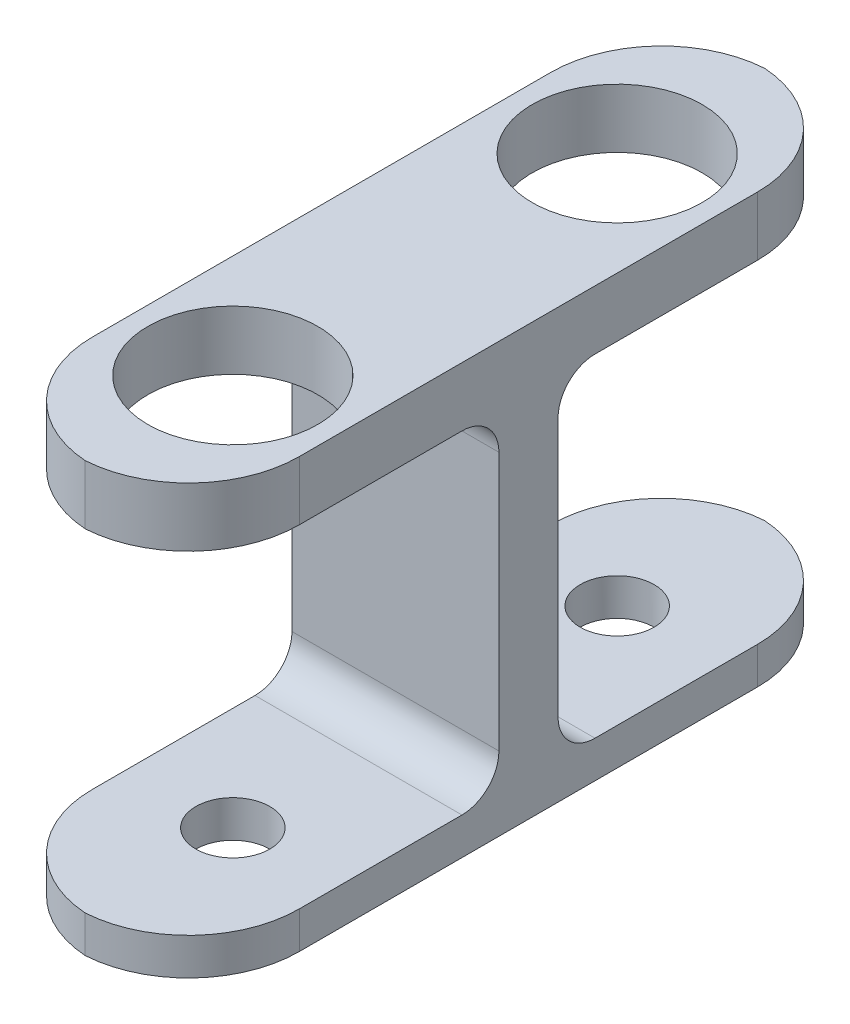
ISO-10303-21;
HEADER;
FILE_DESCRIPTION(('STEP AP214'),'2;1');
FILE_NAME('part.step','',(''),(''),'','','');
FILE_SCHEMA(('AUTOMOTIVE_DESIGN { 1 0 10303 214 1 1 1 1 }'));
ENDSEC;
DATA;
#1=APPLICATION_CONTEXT('core data for automotive mechanical design processes');
#2=APPLICATION_PROTOCOL_DEFINITION('international standard','automotive_design',2000,#1);
#3=PRODUCT_CONTEXT('',#1,'mechanical');
#4=PRODUCT('Part','Part','',(#3));
#5=PRODUCT_RELATED_PRODUCT_CATEGORY('part','',(#4));
#6=PRODUCT_DEFINITION_FORMATION('','',#4);
#7=PRODUCT_DEFINITION_CONTEXT('part definition',#1,'design');
#8=PRODUCT_DEFINITION('design','',#6,#7);
#9=PRODUCT_DEFINITION_SHAPE('','',#8);
#10=(LENGTH_UNIT() NAMED_UNIT(*) SI_UNIT(.MILLI.,.METRE.));
#11=(NAMED_UNIT(*) PLANE_ANGLE_UNIT() SI_UNIT($,.RADIAN.));
#12=(NAMED_UNIT(*) SI_UNIT($,.STERADIAN.) SOLID_ANGLE_UNIT());
#13=UNCERTAINTY_MEASURE_WITH_UNIT(LENGTH_MEASURE(1.E-05),#10,'distance_accuracy_value','');
#14=(GEOMETRIC_REPRESENTATION_CONTEXT(3) GLOBAL_UNCERTAINTY_ASSIGNED_CONTEXT((#13)) GLOBAL_UNIT_ASSIGNED_CONTEXT((#10,
#11,#12)) REPRESENTATION_CONTEXT('',''));
#15=CARTESIAN_POINT('',(0.,0.,0.));
#16=DIRECTION('',(0.,0.,1.));
#17=DIRECTION('',(1.,0.,0.));
#18=AXIS2_PLACEMENT_3D('',#15,#16,#17);
#19=CARTESIAN_POINT('',(28.,0.,0.));
#20=DIRECTION('',(0.,1.,0.));
#21=DIRECTION('',(0.,0.,1.));
#22=AXIS2_PLACEMENT_3D('',#19,#20,#21);
#23=PLANE('',#22);
#24=CARTESIAN_POINT('',(14.,0.,-20.));
#25=DIRECTION('',(0.,1.,0.));
#26=DIRECTION('',(0.,0.,1.));
#27=AXIS2_PLACEMENT_3D('',#24,#25,#26);
#28=CIRCLE('',#27,11.5);
#29=CARTESIAN_POINT('',(14.,0.,-8.5));
#30=VERTEX_POINT('',#29);
#31=EDGE_CURVE('E205',#30,#30,#28,.F.);
#32=ORIENTED_EDGE('',*,*,#31,.F.);
#33=EDGE_LOOP('',(#32));
#34=FACE_BOUND('',#33,.T.);
#35=DIRECTION('',(0.,0.,-1.));
#36=VECTOR('',#35,1.);
#37=CARTESIAN_POINT('',(28.,0.,0.));
#38=LINE('',#37,#36);
#39=CARTESIAN_POINT('',(28.,0.,-15.));
#40=VERTEX_POINT('',#39);
#41=CARTESIAN_POINT('',(28.,0.,-37.));
#42=VERTEX_POINT('',#41);
#43=EDGE_CURVE('E214',#40,#42,#38,.T.);
#44=ORIENTED_EDGE('',*,*,#43,.F.);
#45=CARTESIAN_POINT('',(13.,0.,-15.));
#46=DIRECTION('',(0.,1.,0.));
#47=DIRECTION('',(0.,0.,1.));
#48=AXIS2_PLACEMENT_3D('',#45,#46,#47);
#49=CIRCLE('',#48,15.);
#50=CARTESIAN_POINT('',(14.,0.,-0.0333704529042328));
#51=VERTEX_POINT('',#50);
#52=EDGE_CURVE('E277',#40,#51,#49,.F.);
#53=ORIENTED_EDGE('',*,*,#52,.T.);
#54=CARTESIAN_POINT('',(15.,0.,-15.));
#55=DIRECTION('',(0.,1.,0.));
#56=DIRECTION('',(0.,0.,1.));
#57=AXIS2_PLACEMENT_3D('',#54,#55,#56);
#58=CIRCLE('',#57,15.);
#59=CARTESIAN_POINT('',(0.,0.,-15.));
#60=VERTEX_POINT('',#59);
#61=EDGE_CURVE('E275',#51,#60,#58,.F.);
#62=ORIENTED_EDGE('',*,*,#61,.T.);
#63=DIRECTION('',(0.,0.,-1.));
#64=VECTOR('',#63,1.);
#65=CARTESIAN_POINT('',(0.,0.,0.));
#66=LINE('',#65,#64);
#67=CARTESIAN_POINT('',(0.,0.,-37.));
#68=VERTEX_POINT('',#67);
#69=EDGE_CURVE('E200',#60,#68,#66,.T.);
#70=ORIENTED_EDGE('',*,*,#69,.T.);
#71=DIRECTION('',(-1.,0.,0.));
#72=VECTOR('',#71,1.);
#73=CARTESIAN_POINT('',(28.,0.,-37.));
#74=LINE('',#73,#72);
#75=EDGE_CURVE('E178',#68,#42,#74,.F.);
#76=ORIENTED_EDGE('',*,*,#75,.T.);
#77=EDGE_LOOP('',(#44,#53,#62,#70,#76));
#78=FACE_BOUND('',#77,.T.);
#79=ADVANCED_FACE('F33',(#34,#78),#23,.F.);
#80=CARTESIAN_POINT('',(28.,0.,-42.));
#81=DIRECTION('',(0.,0.,-1.));
#82=DIRECTION('',(0.,1.,0.));
#83=AXIS2_PLACEMENT_3D('',#80,#81,#82);
#84=PLANE('',#83);
#85=DIRECTION('',(0.,-1.,0.));
#86=VECTOR('',#85,1.);
#87=CARTESIAN_POINT('',(28.,0.,-42.));
#88=LINE('',#87,#86);
#89=CARTESIAN_POINT('',(28.,-5.,-42.));
#90=VERTEX_POINT('',#89);
#91=CARTESIAN_POINT('',(28.,-40.,-42.));
#92=VERTEX_POINT('',#91);
#93=EDGE_CURVE('E192',#90,#92,#88,.T.);
#94=ORIENTED_EDGE('',*,*,#93,.F.);
#95=DIRECTION('',(-1.,0.,0.));
#96=VECTOR('',#95,1.);
#97=CARTESIAN_POINT('',(0.,-5.,-42.));
#98=LINE('',#97,#96);
#99=CARTESIAN_POINT('',(0.,-5.,-42.));
#100=VERTEX_POINT('',#99);
#101=EDGE_CURVE('E176',#90,#100,#98,.T.);
#102=ORIENTED_EDGE('',*,*,#101,.T.);
#103=DIRECTION('',(0.,-1.,0.));
#104=VECTOR('',#103,1.);
#105=CARTESIAN_POINT('',(0.,0.,-42.));
#106=LINE('',#105,#104);
#107=CARTESIAN_POINT('',(0.,-40.,-42.));
#108=VERTEX_POINT('',#107);
#109=EDGE_CURVE('E189',#100,#108,#106,.T.);
#110=ORIENTED_EDGE('',*,*,#109,.T.);
#111=DIRECTION('',(-1.,0.,0.));
#112=VECTOR('',#111,1.);
#113=CARTESIAN_POINT('',(28.,-40.,-42.));
#114=LINE('',#113,#112);
#115=EDGE_CURVE('E193',#108,#92,#114,.F.);
#116=ORIENTED_EDGE('',*,*,#115,.T.);
#117=EDGE_LOOP('',(#94,#102,#110,#116));
#118=FACE_BOUND('',#117,.T.);
#119=ADVANCED_FACE('F188',(#118),#84,.F.);
#120=CARTESIAN_POINT('',(28.,-45.,-42.));
#121=DIRECTION('',(0.,-1.,0.));
#122=DIRECTION('',(0.,0.,-1.));
#123=AXIS2_PLACEMENT_3D('',#120,#121,#122);
#124=PLANE('',#123);
#125=CARTESIAN_POINT('',(14.,-45.,-20.));
#126=DIRECTION('',(0.,1.,0.));
#127=DIRECTION('',(0.,0.,1.));
#128=AXIS2_PLACEMENT_3D('',#125,#126,#127);
#129=CIRCLE('',#128,5.);
#130=CARTESIAN_POINT('',(14.,-45.,-15.));
#131=VERTEX_POINT('',#130);
#132=EDGE_CURVE('E335',#131,#131,#129,.T.);
#133=ORIENTED_EDGE('',*,*,#132,.F.);
#134=EDGE_LOOP('',(#133));
#135=FACE_BOUND('',#134,.T.);
#136=CARTESIAN_POINT('',(15.,-45.,-15.));
#137=DIRECTION('',(0.,-1.,0.));
#138=DIRECTION('',(0.,0.,-1.));
#139=AXIS2_PLACEMENT_3D('',#136,#137,#138);
#140=CIRCLE('',#139,15.);
#141=CARTESIAN_POINT('',(0.,-45.,-15.));
#142=VERTEX_POINT('',#141);
#143=CARTESIAN_POINT('',(14.,-45.,-0.0333704529042484));
#144=VERTEX_POINT('',#143);
#145=EDGE_CURVE('E261',#142,#144,#140,.F.);
#146=ORIENTED_EDGE('',*,*,#145,.T.);
#147=CARTESIAN_POINT('',(13.,-45.,-15.));
#148=DIRECTION('',(0.,-1.,0.));
#149=DIRECTION('',(0.,0.,-1.));
#150=AXIS2_PLACEMENT_3D('',#147,#148,#149);
#151=CIRCLE('',#150,15.);
#152=CARTESIAN_POINT('',(28.,-45.,-15.));
#153=VERTEX_POINT('',#152);
#154=EDGE_CURVE('E263',#144,#153,#151,.F.);
#155=ORIENTED_EDGE('',*,*,#154,.T.);
#156=DIRECTION('',(0.,0.,1.));
#157=VECTOR('',#156,1.);
#158=CARTESIAN_POINT('',(28.,-45.,-42.));
#159=LINE('',#158,#157);
#160=CARTESIAN_POINT('',(28.,-45.,-37.));
#161=VERTEX_POINT('',#160);
#162=EDGE_CURVE('E320',#161,#153,#159,.T.);
#163=ORIENTED_EDGE('',*,*,#162,.F.);
#164=DIRECTION('',(-1.,0.,0.));
#165=VECTOR('',#164,1.);
#166=CARTESIAN_POINT('',(0.,-45.,-37.));
#167=LINE('',#166,#165);
#168=CARTESIAN_POINT('',(0.,-45.,-37.));
#169=VERTEX_POINT('',#168);
#170=EDGE_CURVE('E183',#161,#169,#167,.T.);
#171=ORIENTED_EDGE('',*,*,#170,.T.);
#172=DIRECTION('',(0.,0.,1.));
#173=VECTOR('',#172,1.);
#174=CARTESIAN_POINT('',(0.,-45.,-42.));
#175=LINE('',#174,#173);
#176=EDGE_CURVE('E199',#169,#142,#175,.T.);
#177=ORIENTED_EDGE('',*,*,#176,.T.);
#178=EDGE_LOOP('',(#146,#155,#163,#171,#177));
#179=FACE_BOUND('',#178,.T.);
#180=ADVANCED_FACE('F378',(#135,#179),#124,.F.);
#181=CARTESIAN_POINT('',(28.,-50.,0.));
#182=DIRECTION('',(0.,1.,0.));
#183=DIRECTION('',(0.,0.,1.));
#184=AXIS2_PLACEMENT_3D('',#181,#182,#183);
#185=PLANE('',#184);
#186=CARTESIAN_POINT('',(14.,-50.,-72.));
#187=DIRECTION('',(0.,1.,0.));
#188=DIRECTION('',(0.,0.,1.));
#189=AXIS2_PLACEMENT_3D('',#186,#187,#188);
#190=CIRCLE('',#189,5.);
#191=CARTESIAN_POINT('',(14.,-50.,-67.));
#192=VERTEX_POINT('',#191);
#193=EDGE_CURVE('E294',#192,#192,#190,.T.);
#194=ORIENTED_EDGE('',*,*,#193,.T.);
#195=EDGE_LOOP('',(#194));
#196=FACE_BOUND('',#195,.T.);
#197=CARTESIAN_POINT('',(14.,-50.,-20.));
#198=DIRECTION('',(0.,1.,0.));
#199=DIRECTION('',(0.,0.,1.));
#200=AXIS2_PLACEMENT_3D('',#197,#198,#199);
#201=CIRCLE('',#200,5.);
#202=CARTESIAN_POINT('',(14.,-50.,-15.));
#203=VERTEX_POINT('',#202);
#204=EDGE_CURVE('E330',#203,#203,#201,.F.);
#205=ORIENTED_EDGE('',*,*,#204,.F.);
#206=EDGE_LOOP('',(#205));
#207=FACE_BOUND('',#206,.T.);
#208=DIRECTION('',(0.,0.,-1.));
#209=VECTOR('',#208,1.);
#210=CARTESIAN_POINT('',(28.,-50.,0.));
#211=LINE('',#210,#209);
#212=CARTESIAN_POINT('',(28.,-50.,-15.));
#213=VERTEX_POINT('',#212);
#214=CARTESIAN_POINT('',(28.,-50.,-77.));
#215=VERTEX_POINT('',#214);
#216=EDGE_CURVE('E314',#213,#215,#211,.T.);
#217=ORIENTED_EDGE('',*,*,#216,.F.);
#218=CARTESIAN_POINT('',(13.,-50.,-15.));
#219=DIRECTION('',(0.,1.,0.));
#220=DIRECTION('',(0.,0.,1.));
#221=AXIS2_PLACEMENT_3D('',#218,#219,#220);
#222=CIRCLE('',#221,15.);
#223=CARTESIAN_POINT('',(14.,-50.,-0.0333704529042415));
#224=VERTEX_POINT('',#223);
#225=EDGE_CURVE('E259',#213,#224,#222,.F.);
#226=ORIENTED_EDGE('',*,*,#225,.T.);
#227=CARTESIAN_POINT('',(15.,-50.,-15.));
#228=DIRECTION('',(0.,1.,0.));
#229=DIRECTION('',(0.,0.,1.));
#230=AXIS2_PLACEMENT_3D('',#227,#228,#229);
#231=CIRCLE('',#230,15.);
#232=CARTESIAN_POINT('',(0.,-50.,-15.));
#233=VERTEX_POINT('',#232);
#234=EDGE_CURVE('E257',#224,#233,#231,.F.);
#235=ORIENTED_EDGE('',*,*,#234,.T.);
#236=DIRECTION('',(0.,0.,-1.));
#237=VECTOR('',#236,1.);
#238=CARTESIAN_POINT('',(0.,-50.,0.));
#239=LINE('',#238,#237);
#240=CARTESIAN_POINT('',(0.,-50.,-77.));
#241=VERTEX_POINT('',#240);
#242=EDGE_CURVE('E203',#233,#241,#239,.T.);
#243=ORIENTED_EDGE('',*,*,#242,.T.);
#244=CARTESIAN_POINT('',(15.,-50.,-77.));
#245=DIRECTION('',(0.,1.,0.));
#246=DIRECTION('',(0.,0.,1.));
#247=AXIS2_PLACEMENT_3D('',#244,#245,#246);
#248=CIRCLE('',#247,15.);
#249=CARTESIAN_POINT('',(13.9999999999999,-50.,-91.9666295470958));
#250=VERTEX_POINT('',#249);
#251=EDGE_CURVE('E255',#241,#250,#248,.F.);
#252=ORIENTED_EDGE('',*,*,#251,.T.);
#253=CARTESIAN_POINT('',(13.,-50.,-77.));
#254=DIRECTION('',(0.,1.,0.));
#255=DIRECTION('',(0.,0.,1.));
#256=AXIS2_PLACEMENT_3D('',#253,#254,#255);
#257=CIRCLE('',#256,15.);
#258=EDGE_CURVE('E253',#250,#215,#257,.F.);
#259=ORIENTED_EDGE('',*,*,#258,.T.);
#260=EDGE_LOOP('',(#217,#226,#235,#243,#252,#259));
#261=FACE_BOUND('',#260,.T.);
#262=ADVANCED_FACE('F313',(#196,#207,#261),#185,.F.);
#263=CARTESIAN_POINT('',(28.,8.00000000000001,-46.));
#264=DIRECTION('',(0.,-1.,0.));
#265=DIRECTION('',(0.,0.,-1.));
#266=AXIS2_PLACEMENT_3D('',#263,#264,#265);
#267=PLANE('',#266);
#268=CARTESIAN_POINT('',(14.,8.,-72.));
#269=DIRECTION('',(0.,-1.,0.));
#270=DIRECTION('',(0.,0.,-1.));
#271=AXIS2_PLACEMENT_3D('',#268,#269,#270);
#272=CIRCLE('',#271,11.5);
#273=CARTESIAN_POINT('',(14.,8.,-83.5));
#274=VERTEX_POINT('',#273);
#275=EDGE_CURVE('E348',#274,#274,#272,.T.);
#276=ORIENTED_EDGE('',*,*,#275,.T.);
#277=EDGE_LOOP('',(#276));
#278=FACE_BOUND('',#277,.T.);
#279=CARTESIAN_POINT('',(14.,8.,-20.));
#280=DIRECTION('',(0.,1.,0.));
#281=DIRECTION('',(0.,0.,1.));
#282=AXIS2_PLACEMENT_3D('',#279,#280,#281);
#283=CIRCLE('',#282,11.5);
#284=CARTESIAN_POINT('',(14.,8.,-8.5));
#285=VERTEX_POINT('',#284);
#286=EDGE_CURVE('E327',#285,#285,#283,.T.);
#287=ORIENTED_EDGE('',*,*,#286,.F.);
#288=EDGE_LOOP('',(#287));
#289=FACE_BOUND('',#288,.T.);
#290=CARTESIAN_POINT('',(15.,8.,-15.));
#291=DIRECTION('',(0.,-1.,0.));
#292=DIRECTION('',(0.,0.,-1.));
#293=AXIS2_PLACEMENT_3D('',#290,#291,#292);
#294=CIRCLE('',#293,15.);
#295=CARTESIAN_POINT('',(0.,8.,-15.));
#296=VERTEX_POINT('',#295);
#297=CARTESIAN_POINT('',(14.,8.,-0.0333704529042345));
#298=VERTEX_POINT('',#297);
#299=EDGE_CURVE('E283',#296,#298,#294,.F.);
#300=ORIENTED_EDGE('',*,*,#299,.T.);
#301=CARTESIAN_POINT('',(13.,8.,-15.));
#302=DIRECTION('',(0.,-1.,0.));
#303=DIRECTION('',(0.,0.,-1.));
#304=AXIS2_PLACEMENT_3D('',#301,#302,#303);
#305=CIRCLE('',#304,15.);
#306=CARTESIAN_POINT('',(28.,8.,-15.));
#307=VERTEX_POINT('',#306);
#308=EDGE_CURVE('E285',#298,#307,#305,.F.);
#309=ORIENTED_EDGE('',*,*,#308,.T.);
#310=DIRECTION('',(0.,0.,1.));
#311=VECTOR('',#310,1.);
#312=CARTESIAN_POINT('',(28.,8.00000000000001,-46.));
#313=LINE('',#312,#311);
#314=CARTESIAN_POINT('',(28.,8.00000000000001,-77.));
#315=VERTEX_POINT('',#314);
#316=EDGE_CURVE('E215',#315,#307,#313,.T.);
#317=ORIENTED_EDGE('',*,*,#316,.F.);
#318=CARTESIAN_POINT('',(13.,8.00000000000001,-77.));
#319=DIRECTION('',(0.,-1.,0.));
#320=DIRECTION('',(0.,0.,-1.));
#321=AXIS2_PLACEMENT_3D('',#318,#319,#320);
#322=CIRCLE('',#321,15.);
#323=CARTESIAN_POINT('',(14.,8.00000000000001,-91.9666295470958));
#324=VERTEX_POINT('',#323);
#325=EDGE_CURVE('E279',#315,#324,#322,.F.);
#326=ORIENTED_EDGE('',*,*,#325,.T.);
#327=CARTESIAN_POINT('',(15.,8.00000000000001,-77.));
#328=DIRECTION('',(0.,-1.,0.));
#329=DIRECTION('',(0.,0.,-1.));
#330=AXIS2_PLACEMENT_3D('',#327,#328,#329);
#331=CIRCLE('',#330,15.);
#332=CARTESIAN_POINT('',(0.,8.00000000000001,-77.));
#333=VERTEX_POINT('',#332);
#334=EDGE_CURVE('E281',#324,#333,#331,.F.);
#335=ORIENTED_EDGE('',*,*,#334,.T.);
#336=DIRECTION('',(0.,0.,1.));
#337=VECTOR('',#336,1.);
#338=CARTESIAN_POINT('',(0.,8.00000000000001,-46.));
#339=LINE('',#338,#337);
#340=EDGE_CURVE('E211',#333,#296,#339,.T.);
#341=ORIENTED_EDGE('',*,*,#340,.T.);
#342=EDGE_LOOP('',(#300,#309,#317,#326,#335,#341));
#343=FACE_BOUND('',#342,.T.);
#344=ADVANCED_FACE('F377',(#278,#289,#343),#267,.F.);
#345=CARTESIAN_POINT('',(28.,0.,0.));
#346=DIRECTION('',(1.,0.,0.));
#347=DIRECTION('',(0.,0.,-1.));
#348=AXIS2_PLACEMENT_3D('',#345,#346,#347);
#349=PLANE('',#348);
#350=ORIENTED_EDGE('',*,*,#162,.T.);
#351=DIRECTION('',(0.,-1.,0.));
#352=VECTOR('',#351,1.);
#353=CARTESIAN_POINT('',(28.,-50.,-15.));
#354=LINE('',#353,#352);
#355=EDGE_CURVE('E250',#153,#213,#354,.T.);
#356=ORIENTED_EDGE('',*,*,#355,.T.);
#357=ORIENTED_EDGE('',*,*,#216,.T.);
#358=DIRECTION('',(0.,-1.,0.));
#359=VECTOR('',#358,1.);
#360=CARTESIAN_POINT('',(28.,1.04332480140501E-13,-76.9999999999999));
#361=LINE('',#360,#359);
#362=CARTESIAN_POINT('',(28.,-45.,-77.));
#363=VERTEX_POINT('',#362);
#364=EDGE_CURVE('E245',#215,#363,#361,.F.);
#365=ORIENTED_EDGE('',*,*,#364,.T.);
#366=DIRECTION('',(0.,0.,-1.));
#367=VECTOR('',#366,1.);
#368=CARTESIAN_POINT('',(28.,-45.,-50.));
#369=LINE('',#368,#367);
#370=CARTESIAN_POINT('',(28.,-45.,-55.));
#371=VERTEX_POINT('',#370);
#372=EDGE_CURVE('E341',#371,#363,#369,.T.);
#373=ORIENTED_EDGE('',*,*,#372,.F.);
#374=CARTESIAN_POINT('',(28.,-40.,-55.));
#375=DIRECTION('',(1.,0.,0.));
#376=DIRECTION('',(0.,0.,-1.));
#377=AXIS2_PLACEMENT_3D('',#374,#375,#376);
#378=CIRCLE('',#377,5.);
#379=CARTESIAN_POINT('',(28.,-40.,-50.));
#380=VERTEX_POINT('',#379);
#381=EDGE_CURVE('E241',#371,#380,#378,.F.);
#382=ORIENTED_EDGE('',*,*,#381,.T.);
#383=DIRECTION('',(0.,-1.,0.));
#384=VECTOR('',#383,1.);
#385=CARTESIAN_POINT('',(28.,0.,-50.));
#386=LINE('',#385,#384);
#387=CARTESIAN_POINT('',(28.,-5.,-50.));
#388=VERTEX_POINT('',#387);
#389=EDGE_CURVE('E350',#388,#380,#386,.T.);
#390=ORIENTED_EDGE('',*,*,#389,.F.);
#391=CARTESIAN_POINT('',(28.,-5.,-55.));
#392=DIRECTION('',(1.,0.,0.));
#393=DIRECTION('',(0.,0.,-1.));
#394=AXIS2_PLACEMENT_3D('',#391,#392,#393);
#395=CIRCLE('',#394,5.);
#396=CARTESIAN_POINT('',(28.,0.,-55.));
#397=VERTEX_POINT('',#396);
#398=EDGE_CURVE('E236',#388,#397,#395,.F.);
#399=ORIENTED_EDGE('',*,*,#398,.T.);
#400=DIRECTION('',(0.,0.,1.));
#401=VECTOR('',#400,1.);
#402=CARTESIAN_POINT('',(28.,0.,-92.));
#403=LINE('',#402,#401);
#404=CARTESIAN_POINT('',(28.,0.,-77.));
#405=VERTEX_POINT('',#404);
#406=EDGE_CURVE('E338',#405,#397,#403,.T.);
#407=ORIENTED_EDGE('',*,*,#406,.F.);
#408=DIRECTION('',(0.,-1.,0.));
#409=VECTOR('',#408,1.);
#410=CARTESIAN_POINT('',(28.,0.,-77.));
#411=LINE('',#410,#409);
#412=EDGE_CURVE('E243',#405,#315,#411,.F.);
#413=ORIENTED_EDGE('',*,*,#412,.T.);
#414=ORIENTED_EDGE('',*,*,#316,.T.);
#415=DIRECTION('',(0.,-1.,0.));
#416=VECTOR('',#415,1.);
#417=CARTESIAN_POINT('',(28.,0.,-15.));
#418=LINE('',#417,#416);
#419=EDGE_CURVE('E247',#307,#40,#418,.T.);
#420=ORIENTED_EDGE('',*,*,#419,.T.);
#421=ORIENTED_EDGE('',*,*,#43,.T.);
#422=CARTESIAN_POINT('',(28.,-5.,-37.));
#423=DIRECTION('',(1.,0.,0.));
#424=DIRECTION('',(0.,0.,-1.));
#425=AXIS2_PLACEMENT_3D('',#422,#423,#424);
#426=CIRCLE('',#425,5.);
#427=EDGE_CURVE('E182',#42,#90,#426,.F.);
#428=ORIENTED_EDGE('',*,*,#427,.T.);
#429=ORIENTED_EDGE('',*,*,#93,.T.);
#430=CARTESIAN_POINT('',(28.,-40.,-37.));
#431=DIRECTION('',(1.,0.,0.));
#432=DIRECTION('',(0.,0.,-1.));
#433=AXIS2_PLACEMENT_3D('',#430,#431,#432);
#434=CIRCLE('',#433,5.);
#435=EDGE_CURVE('E222',#92,#161,#434,.F.);
#436=ORIENTED_EDGE('',*,*,#435,.T.);
#437=EDGE_LOOP('',(#350,#356,#357,#365,#373,#382,#390,#399,#407,#413,#414,#420,#421,#428,#429,#436));
#438=FACE_BOUND('',#437,.T.);
#439=ADVANCED_FACE('F317',(#438),#349,.T.);
#440=CARTESIAN_POINT('',(0.,0.,0.));
#441=DIRECTION('',(1.,0.,0.));
#442=DIRECTION('',(0.,0.,-1.));
#443=AXIS2_PLACEMENT_3D('',#440,#441,#442);
#444=PLANE('',#443);
#445=ORIENTED_EDGE('',*,*,#242,.F.);
#446=DIRECTION('',(0.,-1.,0.));
#447=VECTOR('',#446,1.);
#448=CARTESIAN_POINT('',(0.,0.,-15.0000000000001));
#449=LINE('',#448,#447);
#450=EDGE_CURVE('E273',#233,#142,#449,.F.);
#451=ORIENTED_EDGE('',*,*,#450,.T.);
#452=ORIENTED_EDGE('',*,*,#176,.F.);
#453=CARTESIAN_POINT('',(0.,-40.,-37.));
#454=DIRECTION('',(1.,0.,0.));
#455=DIRECTION('',(0.,0.,-1.));
#456=AXIS2_PLACEMENT_3D('',#453,#454,#455);
#457=CIRCLE('',#456,5.);
#458=EDGE_CURVE('E198',#169,#108,#457,.T.);
#459=ORIENTED_EDGE('',*,*,#458,.T.);
#460=ORIENTED_EDGE('',*,*,#109,.F.);
#461=CARTESIAN_POINT('',(0.,-5.,-37.));
#462=DIRECTION('',(1.,0.,0.));
#463=DIRECTION('',(0.,0.,-1.));
#464=AXIS2_PLACEMENT_3D('',#461,#462,#463);
#465=CIRCLE('',#464,5.);
#466=EDGE_CURVE('E172',#100,#68,#465,.T.);
#467=ORIENTED_EDGE('',*,*,#466,.T.);
#468=ORIENTED_EDGE('',*,*,#69,.F.);
#469=DIRECTION('',(0.,-1.,0.));
#470=VECTOR('',#469,1.);
#471=CARTESIAN_POINT('',(0.,0.,-15.));
#472=LINE('',#471,#470);
#473=EDGE_CURVE('E271',#60,#296,#472,.F.);
#474=ORIENTED_EDGE('',*,*,#473,.T.);
#475=ORIENTED_EDGE('',*,*,#340,.F.);
#476=DIRECTION('',(0.,-1.,0.));
#477=VECTOR('',#476,1.);
#478=CARTESIAN_POINT('',(0.,0.,-77.));
#479=LINE('',#478,#477);
#480=CARTESIAN_POINT('',(0.,0.,-77.));
#481=VERTEX_POINT('',#480);
#482=EDGE_CURVE('E268',#333,#481,#479,.T.);
#483=ORIENTED_EDGE('',*,*,#482,.T.);
#484=DIRECTION('',(0.,0.,1.));
#485=VECTOR('',#484,1.);
#486=CARTESIAN_POINT('',(0.,0.,-92.));
#487=LINE('',#486,#485);
#488=CARTESIAN_POINT('',(0.,0.,-55.));
#489=VERTEX_POINT('',#488);
#490=EDGE_CURVE('E339',#481,#489,#487,.T.);
#491=ORIENTED_EDGE('',*,*,#490,.T.);
#492=CARTESIAN_POINT('',(0.,-5.,-55.));
#493=DIRECTION('',(1.,0.,0.));
#494=DIRECTION('',(0.,0.,-1.));
#495=AXIS2_PLACEMENT_3D('',#492,#493,#494);
#496=CIRCLE('',#495,5.);
#497=CARTESIAN_POINT('',(0.,-5.,-50.));
#498=VERTEX_POINT('',#497);
#499=EDGE_CURVE('E234',#489,#498,#496,.T.);
#500=ORIENTED_EDGE('',*,*,#499,.T.);
#501=DIRECTION('',(0.,-1.,0.));
#502=VECTOR('',#501,1.);
#503=CARTESIAN_POINT('',(0.,0.,-50.));
#504=LINE('',#503,#502);
#505=CARTESIAN_POINT('',(0.,-40.,-50.));
#506=VERTEX_POINT('',#505);
#507=EDGE_CURVE('E342',#498,#506,#504,.T.);
#508=ORIENTED_EDGE('',*,*,#507,.T.);
#509=CARTESIAN_POINT('',(0.,-40.,-55.));
#510=DIRECTION('',(1.,0.,0.));
#511=DIRECTION('',(0.,0.,-1.));
#512=AXIS2_PLACEMENT_3D('',#509,#510,#511);
#513=CIRCLE('',#512,5.);
#514=CARTESIAN_POINT('',(0.,-45.,-55.));
#515=VERTEX_POINT('',#514);
#516=EDGE_CURVE('E239',#506,#515,#513,.T.);
#517=ORIENTED_EDGE('',*,*,#516,.T.);
#518=DIRECTION('',(0.,0.,-1.));
#519=VECTOR('',#518,1.);
#520=CARTESIAN_POINT('',(0.,-45.,-50.));
#521=LINE('',#520,#519);
#522=CARTESIAN_POINT('',(0.,-45.,-77.));
#523=VERTEX_POINT('',#522);
#524=EDGE_CURVE('E345',#515,#523,#521,.T.);
#525=ORIENTED_EDGE('',*,*,#524,.T.);
#526=DIRECTION('',(0.,-1.,0.));
#527=VECTOR('',#526,1.);
#528=CARTESIAN_POINT('',(0.,-50.,-77.));
#529=LINE('',#528,#527);
#530=EDGE_CURVE('E265',#523,#241,#529,.T.);
#531=ORIENTED_EDGE('',*,*,#530,.T.);
#532=EDGE_LOOP('',(#445,#451,#452,#459,#460,#467,#468,#474,#475,#483,#491,#500,#508,#517,#525,#531));
#533=FACE_BOUND('',#532,.T.);
#534=ADVANCED_FACE('F196',(#533),#444,.F.);
#535=CARTESIAN_POINT('',(14.,-50.001,-20.));
#536=DIRECTION('',(0.,1.,0.));
#537=DIRECTION('',(0.,0.,1.));
#538=AXIS2_PLACEMENT_3D('',#535,#536,#537);
#539=CYLINDRICAL_SURFACE('',#538,11.5);
#540=CARTESIAN_POINT('',(14.,8.,-8.5));
#541=CARTESIAN_POINT('',(14.,7.91666666666667,-8.5));
#542=CARTESIAN_POINT('',(14.,7.83333333333333,-8.5));
#543=CARTESIAN_POINT('',(14.,7.66666666666667,-8.5));
#544=CARTESIAN_POINT('',(14.,7.58333333333333,-8.5));
#545=CARTESIAN_POINT('',(14.,7.41666666666667,-8.5));
#546=CARTESIAN_POINT('',(14.,7.33333333333333,-8.5));
#547=CARTESIAN_POINT('',(14.,7.16666666666667,-8.5));
#548=CARTESIAN_POINT('',(14.,7.08333333333333,-8.5));
#549=CARTESIAN_POINT('',(14.,6.91666666666667,-8.5));
#550=CARTESIAN_POINT('',(14.,6.83333333333333,-8.5));
#551=CARTESIAN_POINT('',(14.,6.66666666666667,-8.5));
#552=CARTESIAN_POINT('',(14.,6.58333333333333,-8.5));
#553=CARTESIAN_POINT('',(14.,6.41666666666667,-8.5));
#554=CARTESIAN_POINT('',(14.,6.33333333333333,-8.5));
#555=CARTESIAN_POINT('',(14.,6.16666666666667,-8.5));
#556=CARTESIAN_POINT('',(14.,6.08333333333333,-8.5));
#557=CARTESIAN_POINT('',(14.,5.91666666666666,-8.5));
#558=CARTESIAN_POINT('',(14.,5.83333333333333,-8.5));
#559=CARTESIAN_POINT('',(14.,5.66666666666666,-8.5));
#560=CARTESIAN_POINT('',(14.,5.58333333333333,-8.5));
#561=CARTESIAN_POINT('',(14.,5.41666666666666,-8.5));
#562=CARTESIAN_POINT('',(14.,5.33333333333333,-8.5));
#563=CARTESIAN_POINT('',(14.,5.16666666666666,-8.5));
#564=CARTESIAN_POINT('',(14.,5.08333333333333,-8.5));
#565=CARTESIAN_POINT('',(14.,4.91666666666666,-8.5));
#566=CARTESIAN_POINT('',(14.,4.83333333333333,-8.5));
#567=CARTESIAN_POINT('',(14.,4.66666666666666,-8.5));
#568=CARTESIAN_POINT('',(14.,4.58333333333333,-8.5));
#569=CARTESIAN_POINT('',(14.,4.41666666666666,-8.5));
#570=CARTESIAN_POINT('',(14.,4.33333333333333,-8.5));
#571=CARTESIAN_POINT('',(14.,4.16666666666666,-8.5));
#572=CARTESIAN_POINT('',(14.,4.08333333333333,-8.5));
#573=CARTESIAN_POINT('',(14.,3.91666666666666,-8.5));
#574=CARTESIAN_POINT('',(14.,3.83333333333333,-8.5));
#575=CARTESIAN_POINT('',(14.,3.66666666666666,-8.5));
#576=CARTESIAN_POINT('',(14.,3.58333333333333,-8.5));
#577=CARTESIAN_POINT('',(14.,3.41666666666666,-8.5));
#578=CARTESIAN_POINT('',(14.,3.33333333333333,-8.5));
#579=CARTESIAN_POINT('',(14.,3.16666666666666,-8.5));
#580=CARTESIAN_POINT('',(14.,3.08333333333333,-8.5));
#581=CARTESIAN_POINT('',(14.,2.91666666666666,-8.5));
#582=CARTESIAN_POINT('',(14.,2.83333333333333,-8.5));
#583=CARTESIAN_POINT('',(14.,2.66666666666666,-8.5));
#584=CARTESIAN_POINT('',(14.,2.58333333333333,-8.5));
#585=CARTESIAN_POINT('',(14.,2.41666666666666,-8.5));
#586=CARTESIAN_POINT('',(14.,2.33333333333333,-8.5));
#587=CARTESIAN_POINT('',(14.,2.16666666666666,-8.5));
#588=CARTESIAN_POINT('',(14.,2.08333333333333,-8.5));
#589=CARTESIAN_POINT('',(14.,1.91666666666666,-8.5));
#590=CARTESIAN_POINT('',(14.,1.83333333333333,-8.5));
#591=CARTESIAN_POINT('',(14.,1.66666666666666,-8.5));
#592=CARTESIAN_POINT('',(14.,1.58333333333333,-8.5));
#593=CARTESIAN_POINT('',(14.,1.41666666666666,-8.5));
#594=CARTESIAN_POINT('',(14.,1.33333333333333,-8.5));
#595=CARTESIAN_POINT('',(14.,1.16666666666666,-8.5));
#596=CARTESIAN_POINT('',(14.,1.08333333333333,-8.5));
#597=CARTESIAN_POINT('',(14.,0.916666666666661,-8.5));
#598=CARTESIAN_POINT('',(14.,0.833333333333327,-8.5));
#599=CARTESIAN_POINT('',(14.,0.66666666666666,-8.5));
#600=CARTESIAN_POINT('',(14.,0.583333333333327,-8.5));
#601=CARTESIAN_POINT('',(14.,0.41666666666666,-8.5));
#602=CARTESIAN_POINT('',(14.,0.333333333333327,-8.5));
#603=CARTESIAN_POINT('',(14.,0.16666666666666,-8.5));
#604=CARTESIAN_POINT('',(14.,0.0833333333333264,-8.5));
#605=CARTESIAN_POINT('',(14.,0.,-8.5));
#606=B_SPLINE_CURVE_WITH_KNOTS('',3,(#540,#541,#542,#543,#544,#545,#546,#547,#548,#549,#550,
#551,#552,#553,#554,#555,#556,#557,#558,#559,#560,#561,#562,#563,#564,#565,#566,#567,#568,#569,
#570,#571,#572,#573,#574,#575,#576,#577,#578,#579,#580,#581,#582,#583,#584,#585,#586,#587,#588,
#589,#590,#591,#592,#593,#594,#595,#596,#597,#598,#599,#600,#601,#602,#603,#604,#605),
.UNSPECIFIED.,.F.,.F.,(4,2,2,2,2,2,2,2,2,2,2,2,2,2,2,2,2,2,2,2,2,2,2,2,2,2,2,2,2,2,2,2,4),(0.,
0.25,0.5,0.750000000000001,1.,1.25,1.5,1.75,2.,2.25,2.5,2.75,3.,3.25,3.5,3.75,4.,4.25,4.5,4.75,
5.,5.25,5.50000000000001,5.75000000000001,6.00000000000001,6.25000000000001,6.50000000000001,
6.75000000000001,7.00000000000001,7.25000000000001,7.50000000000001,7.75000000000001,
8.00000000000001),.UNSPECIFIED.);
#607=EDGE_CURVE('BSEAM384',#285,#30,#606,.T.);
#608=ORIENTED_EDGE('',*,*,#286,.T.);
#609=ORIENTED_EDGE('',*,*,#31,.T.);
#610=ORIENTED_EDGE('',*,*,#607,.T.);
#611=ORIENTED_EDGE('',*,*,#607,.F.);
#612=EDGE_LOOP('',(#608,#610,#609,#611));
#613=FACE_BOUND('',#612,.T.);
#614=ADVANCED_FACE('F384',(#613),#539,.F.);
#615=CARTESIAN_POINT('',(14.,-50.001,-20.));
#616=DIRECTION('',(0.,1.,0.));
#617=DIRECTION('',(0.,0.,1.));
#618=AXIS2_PLACEMENT_3D('',#615,#616,#617);
#619=CYLINDRICAL_SURFACE('',#618,5.);
#620=ORIENTED_EDGE('',*,*,#132,.T.);
#621=EDGE_LOOP('',(#620));
#622=FACE_BOUND('',#621,.T.);
#623=ORIENTED_EDGE('',*,*,#204,.T.);
#624=EDGE_LOOP('',(#623));
#625=FACE_BOUND('',#624,.T.);
#626=ADVANCED_FACE('F382',(#622,#625),#619,.F.);
#627=CARTESIAN_POINT('',(28.,-5.,-37.));
#628=DIRECTION('',(1.,0.,0.));
#629=DIRECTION('',(0.,0.,-1.));
#630=AXIS2_PLACEMENT_3D('',#627,#628,#629);
#631=CYLINDRICAL_SURFACE('',#630,5.);
#632=ORIENTED_EDGE('',*,*,#427,.F.);
#633=ORIENTED_EDGE('',*,*,#75,.F.);
#634=ORIENTED_EDGE('',*,*,#466,.F.);
#635=ORIENTED_EDGE('',*,*,#101,.F.);
#636=EDGE_LOOP('',(#632,#633,#634,#635));
#637=FACE_BOUND('',#636,.T.);
#638=ADVANCED_FACE('F175',(#637),#631,.F.);
#639=CARTESIAN_POINT('',(28.,-40.,-37.));
#640=DIRECTION('',(1.,0.,0.));
#641=DIRECTION('',(0.,0.,-1.));
#642=AXIS2_PLACEMENT_3D('',#639,#640,#641);
#643=CYLINDRICAL_SURFACE('',#642,5.);
#644=ORIENTED_EDGE('',*,*,#435,.F.);
#645=ORIENTED_EDGE('',*,*,#115,.F.);
#646=ORIENTED_EDGE('',*,*,#458,.F.);
#647=ORIENTED_EDGE('',*,*,#170,.F.);
#648=EDGE_LOOP('',(#644,#645,#646,#647));
#649=FACE_BOUND('',#648,.T.);
#650=ADVANCED_FACE('F391',(#649),#643,.F.);
#651=CARTESIAN_POINT('',(28.,-45.,-50.));
#652=DIRECTION('',(0.,1.,0.));
#653=DIRECTION('',(0.,0.,1.));
#654=AXIS2_PLACEMENT_3D('',#651,#652,#653);
#655=PLANE('',#654);
#656=CARTESIAN_POINT('',(14.,-45.,-72.));
#657=DIRECTION('',(0.,-1.,0.));
#658=DIRECTION('',(0.,0.,-1.));
#659=AXIS2_PLACEMENT_3D('',#656,#657,#658);
#660=CIRCLE('',#659,5.);
#661=CARTESIAN_POINT('',(14.,-45.,-77.));
#662=VERTEX_POINT('',#661);
#663=EDGE_CURVE('E359',#662,#662,#660,.T.);
#664=ORIENTED_EDGE('',*,*,#663,.T.);
#665=EDGE_LOOP('',(#664));
#666=FACE_BOUND('',#665,.T.);
#667=CARTESIAN_POINT('',(13.,-45.,-77.));
#668=DIRECTION('',(0.,1.,0.));
#669=DIRECTION('',(0.,0.,1.));
#670=AXIS2_PLACEMENT_3D('',#667,#668,#669);
#671=CIRCLE('',#670,15.);
#672=CARTESIAN_POINT('',(14.,-45.,-91.9666295470958));
#673=VERTEX_POINT('',#672);
#674=EDGE_CURVE('E42',#363,#673,#671,.T.);
#675=ORIENTED_EDGE('',*,*,#674,.T.);
#676=CARTESIAN_POINT('',(15.,-45.,-77.));
#677=DIRECTION('',(0.,1.,0.));
#678=DIRECTION('',(0.,0.,1.));
#679=AXIS2_PLACEMENT_3D('',#676,#677,#678);
#680=CIRCLE('',#679,15.);
#681=EDGE_CURVE('E11',#673,#523,#680,.T.);
#682=ORIENTED_EDGE('',*,*,#681,.T.);
#683=ORIENTED_EDGE('',*,*,#524,.F.);
#684=DIRECTION('',(-1.,0.,0.));
#685=VECTOR('',#684,1.);
#686=CARTESIAN_POINT('',(28.,-45.,-55.));
#687=LINE('',#686,#685);
#688=EDGE_CURVE('E232',#515,#371,#687,.F.);
#689=ORIENTED_EDGE('',*,*,#688,.T.);
#690=ORIENTED_EDGE('',*,*,#372,.T.);
#691=EDGE_LOOP('',(#675,#682,#683,#689,#690));
#692=FACE_BOUND('',#691,.T.);
#693=ADVANCED_FACE('F365',(#666,#692),#655,.T.);
#694=CARTESIAN_POINT('',(28.,0.,-50.));
#695=DIRECTION('',(0.,0.,-1.));
#696=DIRECTION('',(0.,1.,0.));
#697=AXIS2_PLACEMENT_3D('',#694,#695,#696);
#698=PLANE('',#697);
#699=ORIENTED_EDGE('',*,*,#507,.F.);
#700=DIRECTION('',(-1.,0.,0.));
#701=VECTOR('',#700,1.);
#702=CARTESIAN_POINT('',(28.,-5.,-50.));
#703=LINE('',#702,#701);
#704=EDGE_CURVE('E230',#498,#388,#703,.F.);
#705=ORIENTED_EDGE('',*,*,#704,.T.);
#706=ORIENTED_EDGE('',*,*,#389,.T.);
#707=DIRECTION('',(-1.,0.,0.));
#708=VECTOR('',#707,1.);
#709=CARTESIAN_POINT('',(0.,-40.,-50.));
#710=LINE('',#709,#708);
#711=EDGE_CURVE('E227',#380,#506,#710,.T.);
#712=ORIENTED_EDGE('',*,*,#711,.T.);
#713=EDGE_LOOP('',(#699,#705,#706,#712));
#714=FACE_BOUND('',#713,.T.);
#715=ADVANCED_FACE('F496',(#714),#698,.T.);
#716=CARTESIAN_POINT('',(28.,0.,-92.));
#717=DIRECTION('',(0.,-1.,0.));
#718=DIRECTION('',(0.,0.,-1.));
#719=AXIS2_PLACEMENT_3D('',#716,#717,#718);
#720=PLANE('',#719);
#721=CARTESIAN_POINT('',(14.,0.,-72.));
#722=DIRECTION('',(0.,-1.,0.));
#723=DIRECTION('',(0.,0.,-1.));
#724=AXIS2_PLACEMENT_3D('',#721,#722,#723);
#725=CIRCLE('',#724,11.5);
#726=CARTESIAN_POINT('',(14.,0.,-83.5));
#727=VERTEX_POINT('',#726);
#728=EDGE_CURVE('E356',#727,#727,#725,.T.);
#729=ORIENTED_EDGE('',*,*,#728,.F.);
#730=EDGE_LOOP('',(#729));
#731=FACE_BOUND('',#730,.T.);
#732=ORIENTED_EDGE('',*,*,#490,.F.);
#733=CARTESIAN_POINT('',(15.,0.,-77.));
#734=DIRECTION('',(0.,-1.,0.));
#735=DIRECTION('',(0.,0.,-1.));
#736=AXIS2_PLACEMENT_3D('',#733,#734,#735);
#737=CIRCLE('',#736,15.);
#738=CARTESIAN_POINT('',(14.,0.,-91.9666295470958));
#739=VERTEX_POINT('',#738);
#740=EDGE_CURVE('E56',#481,#739,#737,.T.);
#741=ORIENTED_EDGE('',*,*,#740,.T.);
#742=CARTESIAN_POINT('',(13.,0.,-77.));
#743=DIRECTION('',(0.,-1.,0.));
#744=DIRECTION('',(0.,0.,-1.));
#745=AXIS2_PLACEMENT_3D('',#742,#743,#744);
#746=CIRCLE('',#745,15.);
#747=EDGE_CURVE('E287',#739,#405,#746,.T.);
#748=ORIENTED_EDGE('',*,*,#747,.T.);
#749=ORIENTED_EDGE('',*,*,#406,.T.);
#750=DIRECTION('',(-1.,0.,0.));
#751=VECTOR('',#750,1.);
#752=CARTESIAN_POINT('',(0.,0.,-55.));
#753=LINE('',#752,#751);
#754=EDGE_CURVE('E224',#397,#489,#753,.T.);
#755=ORIENTED_EDGE('',*,*,#754,.T.);
#756=EDGE_LOOP('',(#732,#741,#748,#749,#755));
#757=FACE_BOUND('',#756,.T.);
#758=ADVANCED_FACE('F488',(#731,#757),#720,.T.);
#759=CARTESIAN_POINT('',(14.,-50.001,-72.));
#760=DIRECTION('',(0.,1.,0.));
#761=DIRECTION('',(0.,0.,1.));
#762=AXIS2_PLACEMENT_3D('',#759,#760,#761);
#763=CYLINDRICAL_SURFACE('',#762,11.5);
#764=ORIENTED_EDGE('',*,*,#728,.T.);
#765=EDGE_LOOP('',(#764));
#766=FACE_BOUND('',#765,.T.);
#767=ORIENTED_EDGE('',*,*,#275,.F.);
#768=EDGE_LOOP('',(#767));
#769=FACE_BOUND('',#768,.T.);
#770=ADVANCED_FACE('F371',(#766,#769),#763,.F.);
#771=CARTESIAN_POINT('',(14.,-50.001,-72.));
#772=DIRECTION('',(0.,1.,0.));
#773=DIRECTION('',(0.,0.,1.));
#774=AXIS2_PLACEMENT_3D('',#771,#772,#773);
#775=CYLINDRICAL_SURFACE('',#774,5.);
#776=ORIENTED_EDGE('',*,*,#663,.F.);
#777=EDGE_LOOP('',(#776));
#778=FACE_BOUND('',#777,.T.);
#779=ORIENTED_EDGE('',*,*,#193,.F.);
#780=EDGE_LOOP('',(#779));
#781=FACE_BOUND('',#780,.T.);
#782=ADVANCED_FACE('F367',(#778,#781),#775,.F.);
#783=CARTESIAN_POINT('',(28.,-5.,-55.));
#784=DIRECTION('',(1.,0.,0.));
#785=DIRECTION('',(0.,0.,-1.));
#786=AXIS2_PLACEMENT_3D('',#783,#784,#785);
#787=CYLINDRICAL_SURFACE('',#786,5.);
#788=ORIENTED_EDGE('',*,*,#398,.F.);
#789=ORIENTED_EDGE('',*,*,#704,.F.);
#790=ORIENTED_EDGE('',*,*,#499,.F.);
#791=ORIENTED_EDGE('',*,*,#754,.F.);
#792=EDGE_LOOP('',(#788,#789,#790,#791));
#793=FACE_BOUND('',#792,.T.);
#794=ADVANCED_FACE('F370',(#793),#787,.F.);
#795=CARTESIAN_POINT('',(28.,-40.,-55.));
#796=DIRECTION('',(1.,0.,0.));
#797=DIRECTION('',(0.,0.,-1.));
#798=AXIS2_PLACEMENT_3D('',#795,#796,#797);
#799=CYLINDRICAL_SURFACE('',#798,5.);
#800=ORIENTED_EDGE('',*,*,#381,.F.);
#801=ORIENTED_EDGE('',*,*,#688,.F.);
#802=ORIENTED_EDGE('',*,*,#516,.F.);
#803=ORIENTED_EDGE('',*,*,#711,.F.);
#804=EDGE_LOOP('',(#800,#801,#802,#803));
#805=FACE_BOUND('',#804,.T.);
#806=ADVANCED_FACE('F412',(#805),#799,.F.);
#807=CARTESIAN_POINT('',(15.,-45.,-15.));
#808=DIRECTION('',(0.,-1.,0.));
#809=DIRECTION('',(0.,0.,-1.));
#810=AXIS2_PLACEMENT_3D('',#807,#808,#809);
#811=CYLINDRICAL_SURFACE('',#810,15.);
#812=DIRECTION('',(0.,-1.,0.));
#813=VECTOR('',#812,1.);
#814=CARTESIAN_POINT('',(14.,-47.5,-0.0333704529042432));
#815=LINE('',#814,#813);
#816=EDGE_CURVE('E291',#144,#224,#815,.T.);
#817=ORIENTED_EDGE('',*,*,#816,.F.);
#818=ORIENTED_EDGE('',*,*,#145,.F.);
#819=ORIENTED_EDGE('',*,*,#450,.F.);
#820=ORIENTED_EDGE('',*,*,#234,.F.);
#821=EDGE_LOOP('',(#817,#818,#819,#820));
#822=FACE_BOUND('',#821,.T.);
#823=ADVANCED_FACE('F416',(#822),#811,.T.);
#824=CARTESIAN_POINT('',(13.,0.,-15.0000000000001));
#825=DIRECTION('',(0.,1.,0.));
#826=DIRECTION('',(0.,0.,1.));
#827=AXIS2_PLACEMENT_3D('',#824,#825,#826);
#828=CYLINDRICAL_SURFACE('',#827,15.);
#829=ORIENTED_EDGE('',*,*,#154,.F.);
#830=ORIENTED_EDGE('',*,*,#816,.T.);
#831=ORIENTED_EDGE('',*,*,#225,.F.);
#832=ORIENTED_EDGE('',*,*,#355,.F.);
#833=EDGE_LOOP('',(#829,#830,#831,#832));
#834=FACE_BOUND('',#833,.T.);
#835=ADVANCED_FACE('F418',(#834),#828,.T.);
#836=CARTESIAN_POINT('',(15.,8.,-15.));
#837=DIRECTION('',(0.,-1.,0.));
#838=DIRECTION('',(0.,0.,-1.));
#839=AXIS2_PLACEMENT_3D('',#836,#837,#838);
#840=CYLINDRICAL_SURFACE('',#839,15.);
#841=DIRECTION('',(0.,-1.,0.));
#842=VECTOR('',#841,1.);
#843=CARTESIAN_POINT('',(14.,4.,-0.0333704529042328));
#844=LINE('',#843,#842);
#845=EDGE_CURVE('E295',#298,#51,#844,.T.);
#846=ORIENTED_EDGE('',*,*,#845,.F.);
#847=ORIENTED_EDGE('',*,*,#299,.F.);
#848=ORIENTED_EDGE('',*,*,#473,.F.);
#849=ORIENTED_EDGE('',*,*,#61,.F.);
#850=EDGE_LOOP('',(#846,#847,#848,#849));
#851=FACE_BOUND('',#850,.T.);
#852=ADVANCED_FACE('F421',(#851),#840,.T.);
#853=CARTESIAN_POINT('',(13.,0.,-15.));
#854=DIRECTION('',(0.,1.,0.));
#855=DIRECTION('',(0.,0.,1.));
#856=AXIS2_PLACEMENT_3D('',#853,#854,#855);
#857=CYLINDRICAL_SURFACE('',#856,15.);
#858=ORIENTED_EDGE('',*,*,#308,.F.);
#859=ORIENTED_EDGE('',*,*,#845,.T.);
#860=ORIENTED_EDGE('',*,*,#52,.F.);
#861=ORIENTED_EDGE('',*,*,#419,.F.);
#862=EDGE_LOOP('',(#858,#859,#860,#861));
#863=FACE_BOUND('',#862,.T.);
#864=ADVANCED_FACE('F426',(#863),#857,.T.);
#865=CARTESIAN_POINT('',(13.,8.,-77.));
#866=DIRECTION('',(0.,-1.,0.));
#867=DIRECTION('',(0.,0.,-1.));
#868=AXIS2_PLACEMENT_3D('',#865,#866,#867);
#869=CYLINDRICAL_SURFACE('',#868,15.);
#870=DIRECTION('',(0.,-1.,0.));
#871=VECTOR('',#870,1.);
#872=CARTESIAN_POINT('',(14.,4.00000000000001,-91.9666295470958));
#873=LINE('',#872,#871);
#874=EDGE_CURVE('E297',#324,#739,#873,.T.);
#875=ORIENTED_EDGE('',*,*,#874,.F.);
#876=ORIENTED_EDGE('',*,*,#325,.F.);
#877=ORIENTED_EDGE('',*,*,#412,.F.);
#878=ORIENTED_EDGE('',*,*,#747,.F.);
#879=EDGE_LOOP('',(#875,#876,#877,#878));
#880=FACE_BOUND('',#879,.T.);
#881=ADVANCED_FACE('F429',(#880),#869,.T.);
#882=CARTESIAN_POINT('',(15.,0.,-77.));
#883=DIRECTION('',(0.,1.,0.));
#884=DIRECTION('',(0.,0.,1.));
#885=AXIS2_PLACEMENT_3D('',#882,#883,#884);
#886=CYLINDRICAL_SURFACE('',#885,15.);
#887=ORIENTED_EDGE('',*,*,#334,.F.);
#888=ORIENTED_EDGE('',*,*,#874,.T.);
#889=ORIENTED_EDGE('',*,*,#740,.F.);
#890=ORIENTED_EDGE('',*,*,#482,.F.);
#891=EDGE_LOOP('',(#887,#888,#889,#890));
#892=FACE_BOUND('',#891,.T.);
#893=ADVANCED_FACE('F434',(#892),#886,.T.);
#894=CARTESIAN_POINT('',(13.,-45.,-77.));
#895=DIRECTION('',(0.,-1.,0.));
#896=DIRECTION('',(0.,0.,-1.));
#897=AXIS2_PLACEMENT_3D('',#894,#895,#896);
#898=CYLINDRICAL_SURFACE('',#897,15.);
#899=DIRECTION('',(0.,-1.,0.));
#900=VECTOR('',#899,1.);
#901=CARTESIAN_POINT('',(13.9999999999999,-47.5,-91.9666295470958));
#902=LINE('',#901,#900);
#903=EDGE_CURVE('E37',#673,#250,#902,.T.);
#904=ORIENTED_EDGE('',*,*,#903,.F.);
#905=ORIENTED_EDGE('',*,*,#674,.F.);
#906=ORIENTED_EDGE('',*,*,#364,.F.);
#907=ORIENTED_EDGE('',*,*,#258,.F.);
#908=EDGE_LOOP('',(#904,#905,#906,#907));
#909=FACE_BOUND('',#908,.T.);
#910=ADVANCED_FACE('F35',(#909),#898,.T.);
#911=CARTESIAN_POINT('',(15.,1.04332480140501E-13,-76.9999999999999));
#912=DIRECTION('',(0.,1.,0.));
#913=DIRECTION('',(0.,0.,1.));
#914=AXIS2_PLACEMENT_3D('',#911,#912,#913);
#915=CYLINDRICAL_SURFACE('',#914,15.);
#916=ORIENTED_EDGE('',*,*,#681,.F.);
#917=ORIENTED_EDGE('',*,*,#903,.T.);
#918=ORIENTED_EDGE('',*,*,#251,.F.);
#919=ORIENTED_EDGE('',*,*,#530,.F.);
#920=EDGE_LOOP('',(#916,#917,#918,#919));
#921=FACE_BOUND('',#920,.T.);
#922=ADVANCED_FACE('F305',(#921),#915,.T.);
#923=CLOSED_SHELL('',(#79,#119,#180,#262,#344,#439,#534,#614,#626,#638,#650,#693,#715,#758,#770,
#782,#794,#806,#823,#835,#852,#864,#881,#893,#910,#922));
#924=MANIFOLD_SOLID_BREP('B2',#923);
#925=ADVANCED_BREP_SHAPE_REPRESENTATION('',(#18,#924),#14);
#926=SHAPE_DEFINITION_REPRESENTATION(#9,#925);
ENDSEC;
END-ISO-10303-21;
